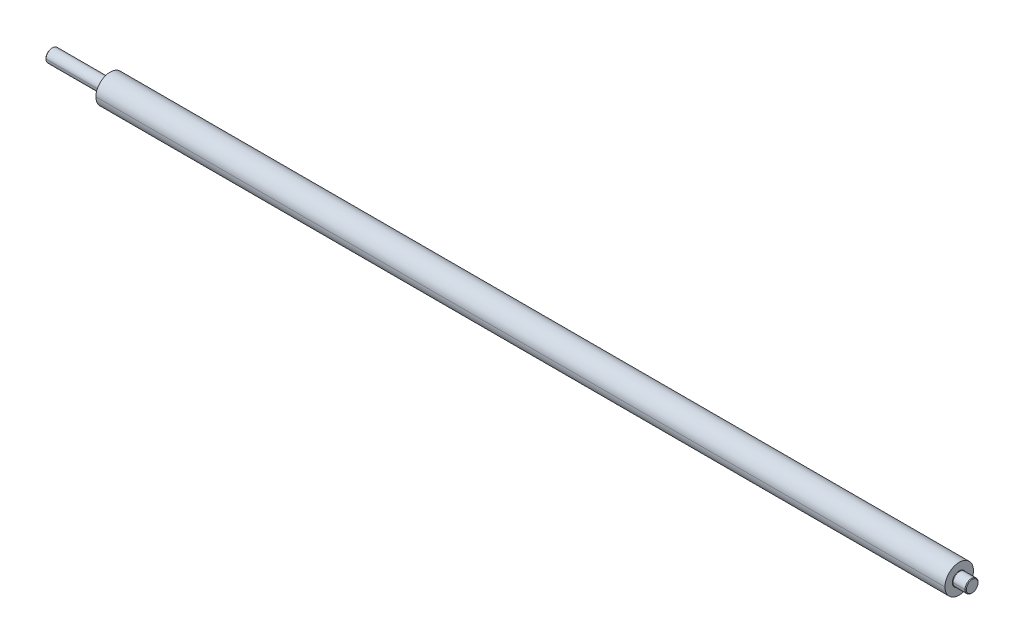
ISO-10303-21;
HEADER;
FILE_DESCRIPTION(('STEP AP214'),'2;1');
FILE_NAME('part.step','',(''),(''),'','','');
FILE_SCHEMA(('AUTOMOTIVE_DESIGN { 1 0 10303 214 1 1 1 1 }'));
ENDSEC;
DATA;
#1=APPLICATION_CONTEXT('core data for automotive mechanical design processes');
#2=APPLICATION_PROTOCOL_DEFINITION('international standard','automotive_design',2000,#1);
#3=PRODUCT_CONTEXT('',#1,'mechanical');
#4=PRODUCT('Part','Part','',(#3));
#5=PRODUCT_RELATED_PRODUCT_CATEGORY('part','',(#4));
#6=PRODUCT_DEFINITION_FORMATION('','',#4);
#7=PRODUCT_DEFINITION_CONTEXT('part definition',#1,'design');
#8=PRODUCT_DEFINITION('design','',#6,#7);
#9=PRODUCT_DEFINITION_SHAPE('','',#8);
#10=(LENGTH_UNIT() NAMED_UNIT(*) SI_UNIT(.MILLI.,.METRE.));
#11=(NAMED_UNIT(*) PLANE_ANGLE_UNIT() SI_UNIT($,.RADIAN.));
#12=(NAMED_UNIT(*) SI_UNIT($,.STERADIAN.) SOLID_ANGLE_UNIT());
#13=UNCERTAINTY_MEASURE_WITH_UNIT(LENGTH_MEASURE(1.E-05),#10,'distance_accuracy_value','');
#14=(GEOMETRIC_REPRESENTATION_CONTEXT(3) GLOBAL_UNCERTAINTY_ASSIGNED_CONTEXT((#13)) GLOBAL_UNIT_ASSIGNED_CONTEXT((#10,
#11,#12)) REPRESENTATION_CONTEXT('',''));
#15=CARTESIAN_POINT('',(0.,0.,0.));
#16=DIRECTION('',(0.,0.,1.));
#17=DIRECTION('',(1.,0.,0.));
#18=AXIS2_PLACEMENT_3D('',#15,#16,#17);
#19=CARTESIAN_POINT('',(45.,0.,0.));
#20=DIRECTION('',(1.,0.,0.));
#21=DIRECTION('',(0.,0.,-1.));
#22=AXIS2_PLACEMENT_3D('',#19,#20,#21);
#23=PLANE('',#22);
#24=CARTESIAN_POINT('',(45.,0.,0.));
#25=DIRECTION('',(1.,0.,0.));
#26=DIRECTION('',(0.,0.,-1.));
#27=AXIS2_PLACEMENT_3D('',#24,#25,#26);
#28=CIRCLE('',#27,11.);
#29=CARTESIAN_POINT('',(45.,0.,11.));
#30=VERTEX_POINT('',#29);
#31=CARTESIAN_POINT('',(45.,0.,-11.));
#32=VERTEX_POINT('',#31);
#33=EDGE_CURVE('E11',#30,#32,#28,.T.);
#34=ORIENTED_EDGE('',*,*,#33,.F.);
#35=CARTESIAN_POINT('',(45.,0.,0.));
#36=DIRECTION('',(1.,0.,0.));
#37=DIRECTION('',(0.,0.,-1.));
#38=AXIS2_PLACEMENT_3D('',#35,#36,#37);
#39=CIRCLE('',#38,11.);
#40=EDGE_CURVE('E26',#32,#30,#39,.T.);
#41=ORIENTED_EDGE('',*,*,#40,.F.);
#42=EDGE_LOOP('',(#34,#41));
#43=FACE_BOUND('',#42,.T.);
#44=CARTESIAN_POINT('',(45.,0.,0.));
#45=DIRECTION('',(1.,0.,0.));
#46=DIRECTION('',(0.,0.,-1.));
#47=AXIS2_PLACEMENT_3D('',#44,#45,#46);
#48=CIRCLE('',#47,5.3);
#49=CARTESIAN_POINT('',(44.9999999999999,5.0405995363642,1.63779007018718));
#50=VERTEX_POINT('',#49);
#51=CARTESIAN_POINT('',(44.9999999999999,-5.0405995363642,-1.63779007018718));
#52=VERTEX_POINT('',#51);
#53=EDGE_CURVE('E251',#50,#52,#48,.T.);
#54=ORIENTED_EDGE('',*,*,#53,.T.);
#55=CARTESIAN_POINT('',(45.,-5.04059953636431,-1.63779007018722));
#56=CARTESIAN_POINT('',(45.,-4.52559033783726,-3.22063693866093));
#57=CARTESIAN_POINT('',(45.,-3.3917749273373,-4.6057664224149));
#58=CARTESIAN_POINT('',(45.,-1.7315428505631,-5.44954277934704));
#59=CARTESIAN_POINT('',(45.,1.83934733064044,-5.66092899865932));
#60=CARTESIAN_POINT('',(45.,4.6040084700311,-3.39099736879158));
#61=CARTESIAN_POINT('',(45.,5.4512051359101,-1.73250802647092));
#62=CARTESIAN_POINT('',(45.,5.55432238842267,0.0545252424096536));
#63=CARTESIAN_POINT('',(45.,5.04059953636431,1.63779007018722));
#64=B_SPLINE_CURVE_WITH_KNOTS('',5,(#55,#56,#57,#58,#59,#60,#61,#62,#63),.UNSPECIFIED.,.F.,.F.,
(6,3,6),(0.,1.5707963267949,3.14159265358979),.UNSPECIFIED.);
#65=EDGE_CURVE('E254',#52,#50,#64,.T.);
#66=ORIENTED_EDGE('',*,*,#65,.T.);
#67=EDGE_LOOP('',(#54,#66));
#68=FACE_BOUND('',#67,.T.);
#69=ADVANCED_FACE('F17',(#43,#68),#23,.F.);
#70=CARTESIAN_POINT('',(44.7,0.,0.));
#71=DIRECTION('',(1.,0.,0.));
#72=DIRECTION('',(0.,-0.309016994374947,0.951056516295154));
#73=AXIS2_PLACEMENT_3D('',#70,#71,#72);
#74=TOROIDAL_SURFACE('',#73,5.29999999999988,0.29999999999988);
#75=CARTESIAN_POINT('',(44.7,-5.0405995363642,-1.63779007018718));
#76=DIRECTION('',(0.,0.309016994374946,-0.951056516295154));
#77=DIRECTION('',(0.,0.951056516295154,0.309016994374946));
#78=AXIS2_PLACEMENT_3D('',#75,#76,#77);
#79=CIRCLE('',#78,0.29999999999988);
#80=CARTESIAN_POINT('',(44.7,-4.75528258147577,-1.54508497187474));
#81=VERTEX_POINT('',#80);
#82=EDGE_CURVE('E261',#81,#52,#79,.T.);
#83=ORIENTED_EDGE('',*,*,#82,.F.);
#84=CARTESIAN_POINT('',(44.7,0.,0.));
#85=DIRECTION('',(1.,0.,0.));
#86=DIRECTION('',(0.,0.,-1.));
#87=AXIS2_PLACEMENT_3D('',#84,#85,#86);
#88=CIRCLE('',#87,5.);
#89=CARTESIAN_POINT('',(44.7,0.,-5.));
#90=VERTEX_POINT('',#89);
#91=EDGE_CURVE('E265',#81,#90,#88,.T.);
#92=ORIENTED_EDGE('',*,*,#91,.T.);
#93=CARTESIAN_POINT('',(44.7,0.,0.));
#94=DIRECTION('',(1.,0.,0.));
#95=DIRECTION('',(0.,0.,-1.));
#96=AXIS2_PLACEMENT_3D('',#93,#94,#95);
#97=CIRCLE('',#96,5.);
#98=CARTESIAN_POINT('',(44.7,4.75528258147577,1.54508497187474));
#99=VERTEX_POINT('',#98);
#100=EDGE_CURVE('E275',#90,#99,#97,.T.);
#101=ORIENTED_EDGE('',*,*,#100,.T.);
#102=CARTESIAN_POINT('',(44.7,5.0405995363642,1.63779007018718));
#103=DIRECTION('',(0.,-0.309016994374946,0.951056516295154));
#104=DIRECTION('',(0.,-0.951056516295154,-0.309016994374946));
#105=AXIS2_PLACEMENT_3D('',#102,#103,#104);
#106=CIRCLE('',#105,0.29999999999988);
#107=EDGE_CURVE('E268',#99,#50,#106,.T.);
#108=ORIENTED_EDGE('',*,*,#107,.T.);
#109=ORIENTED_EDGE('',*,*,#65,.F.);
#110=EDGE_LOOP('',(#83,#92,#101,#108,#109));
#111=FACE_BOUND('',#110,.T.);
#112=ADVANCED_FACE('F243',(#111),#74,.F.);
#113=CARTESIAN_POINT('',(44.7,0.,0.));
#114=DIRECTION('',(1.,0.,0.));
#115=DIRECTION('',(0.,0.309016994374947,-0.951056516295154));
#116=AXIS2_PLACEMENT_3D('',#113,#114,#115);
#117=TOROIDAL_SURFACE('',#116,5.29999999999988,0.29999999999988);
#118=ORIENTED_EDGE('',*,*,#82,.T.);
#119=ORIENTED_EDGE('',*,*,#53,.F.);
#120=ORIENTED_EDGE('',*,*,#107,.F.);
#121=CARTESIAN_POINT('',(44.7,0.,0.));
#122=DIRECTION('',(1.,0.,0.));
#123=DIRECTION('',(0.,0.,-1.));
#124=AXIS2_PLACEMENT_3D('',#121,#122,#123);
#125=CIRCLE('',#124,5.);
#126=CARTESIAN_POINT('',(44.7,0.,5.));
#127=VERTEX_POINT('',#126);
#128=EDGE_CURVE('E276',#99,#127,#125,.T.);
#129=ORIENTED_EDGE('',*,*,#128,.T.);
#130=CARTESIAN_POINT('',(44.7,0.,0.));
#131=DIRECTION('',(1.,0.,0.));
#132=DIRECTION('',(0.,0.,-1.));
#133=AXIS2_PLACEMENT_3D('',#130,#131,#132);
#134=CIRCLE('',#133,5.);
#135=EDGE_CURVE('E263',#127,#81,#134,.T.);
#136=ORIENTED_EDGE('',*,*,#135,.T.);
#137=EDGE_LOOP('',(#118,#119,#120,#129,#136));
#138=FACE_BOUND('',#137,.T.);
#139=ADVANCED_FACE('F247',(#138),#117,.F.);
#140=CARTESIAN_POINT('',(45.,0.,0.));
#141=DIRECTION('',(1.,0.,0.));
#142=DIRECTION('',(0.,1.,0.));
#143=AXIS2_PLACEMENT_3D('',#140,#141,#142);
#144=CYLINDRICAL_SURFACE('',#143,5.);
#145=DIRECTION('',(1.,0.,0.));
#146=VECTOR('',#145,1.);
#147=CARTESIAN_POINT('',(0.5,0.,5.));
#148=LINE('',#147,#146);
#149=CARTESIAN_POINT('',(0.500000000000001,0.,5.));
#150=VERTEX_POINT('',#149);
#151=EDGE_CURVE('E348',#150,#127,#148,.T.);
#152=ORIENTED_EDGE('',*,*,#151,.F.);
#153=CARTESIAN_POINT('',(0.5,0.,0.));
#154=DIRECTION('',(1.,0.,0.));
#155=DIRECTION('',(0.,0.,-1.));
#156=AXIS2_PLACEMENT_3D('',#153,#154,#155);
#157=CIRCLE('',#156,5.);
#158=CARTESIAN_POINT('',(0.5,0.,-5.));
#159=VERTEX_POINT('',#158);
#160=EDGE_CURVE('E344',#150,#159,#157,.T.);
#161=ORIENTED_EDGE('',*,*,#160,.T.);
#162=DIRECTION('',(1.,0.,0.));
#163=VECTOR('',#162,1.);
#164=CARTESIAN_POINT('',(0.5,0.,-5.));
#165=LINE('',#164,#163);
#166=EDGE_CURVE('E339',#159,#90,#165,.T.);
#167=ORIENTED_EDGE('',*,*,#166,.T.);
#168=ORIENTED_EDGE('',*,*,#91,.F.);
#169=ORIENTED_EDGE('',*,*,#135,.F.);
#170=EDGE_LOOP('',(#152,#161,#167,#168,#169));
#171=FACE_BOUND('',#170,.T.);
#172=ADVANCED_FACE('F366',(#171),#144,.T.);
#173=CARTESIAN_POINT('',(45.,0.,0.));
#174=DIRECTION('',(1.,0.,0.));
#175=DIRECTION('',(0.,-1.,0.));
#176=AXIS2_PLACEMENT_3D('',#173,#174,#175);
#177=CYLINDRICAL_SURFACE('',#176,5.);
#178=ORIENTED_EDGE('',*,*,#151,.T.);
#179=ORIENTED_EDGE('',*,*,#128,.F.);
#180=ORIENTED_EDGE('',*,*,#100,.F.);
#181=ORIENTED_EDGE('',*,*,#166,.F.);
#182=CARTESIAN_POINT('',(0.5,0.,0.));
#183=DIRECTION('',(1.,0.,0.));
#184=DIRECTION('',(0.,0.,-1.));
#185=AXIS2_PLACEMENT_3D('',#182,#183,#184);
#186=CIRCLE('',#185,5.);
#187=EDGE_CURVE('E334',#159,#150,#186,.T.);
#188=ORIENTED_EDGE('',*,*,#187,.T.);
#189=EDGE_LOOP('',(#178,#179,#180,#181,#188));
#190=FACE_BOUND('',#189,.T.);
#191=ADVANCED_FACE('F362',(#190),#177,.T.);
#192=CARTESIAN_POINT('',(0.,0.,0.));
#193=DIRECTION('',(1.,0.,0.));
#194=DIRECTION('',(0.,-1.,0.));
#195=AXIS2_PLACEMENT_3D('',#192,#193,#194);
#196=CONICAL_SURFACE('',#195,4.5,0.785398163397448);
#197=DIRECTION('',(0.707106781186548,0.,0.707106781186547));
#198=VECTOR('',#197,1.);
#199=CARTESIAN_POINT('',(0.,0.,4.5));
#200=LINE('',#199,#198);
#201=CARTESIAN_POINT('',(0.,0.,4.5));
#202=VERTEX_POINT('',#201);
#203=EDGE_CURVE('E329',#202,#150,#200,.T.);
#204=ORIENTED_EDGE('',*,*,#203,.T.);
#205=ORIENTED_EDGE('',*,*,#187,.F.);
#206=DIRECTION('',(0.707106781186548,0.,-0.707106781186547));
#207=VECTOR('',#206,1.);
#208=CARTESIAN_POINT('',(0.,0.,-4.5));
#209=LINE('',#208,#207);
#210=CARTESIAN_POINT('',(0.,0.,-4.5));
#211=VERTEX_POINT('',#210);
#212=EDGE_CURVE('E324',#211,#159,#209,.T.);
#213=ORIENTED_EDGE('',*,*,#212,.F.);
#214=CARTESIAN_POINT('',(0.,0.,0.));
#215=DIRECTION('',(1.,0.,0.));
#216=DIRECTION('',(0.,0.,-1.));
#217=AXIS2_PLACEMENT_3D('',#214,#215,#216);
#218=CIRCLE('',#217,4.5);
#219=EDGE_CURVE('E313',#211,#202,#218,.T.);
#220=ORIENTED_EDGE('',*,*,#219,.T.);
#221=EDGE_LOOP('',(#204,#205,#213,#220));
#222=FACE_BOUND('',#221,.T.);
#223=ADVANCED_FACE('F374',(#222),#196,.T.);
#224=CARTESIAN_POINT('',(0.,0.,0.));
#225=DIRECTION('',(1.,0.,0.));
#226=DIRECTION('',(0.,0.,-1.));
#227=AXIS2_PLACEMENT_3D('',#224,#225,#226);
#228=PLANE('',#227);
#229=CARTESIAN_POINT('',(0.,0.,0.));
#230=DIRECTION('',(1.,0.,0.));
#231=DIRECTION('',(0.,0.,-1.));
#232=AXIS2_PLACEMENT_3D('',#229,#230,#231);
#233=CIRCLE('',#232,4.5);
#234=EDGE_CURVE('E310',#202,#211,#233,.T.);
#235=ORIENTED_EDGE('',*,*,#234,.F.);
#236=ORIENTED_EDGE('',*,*,#219,.F.);
#237=EDGE_LOOP('',(#235,#236));
#238=FACE_BOUND('',#237,.T.);
#239=ADVANCED_FACE('F376',(#238),#228,.F.);
#240=CARTESIAN_POINT('',(0.,0.,0.));
#241=DIRECTION('',(1.,0.,0.));
#242=DIRECTION('',(0.,1.,0.));
#243=AXIS2_PLACEMENT_3D('',#240,#241,#242);
#244=CONICAL_SURFACE('',#243,4.5,0.785398163397448);
#245=ORIENTED_EDGE('',*,*,#203,.F.);
#246=ORIENTED_EDGE('',*,*,#234,.T.);
#247=ORIENTED_EDGE('',*,*,#212,.T.);
#248=ORIENTED_EDGE('',*,*,#160,.F.);
#249=EDGE_LOOP('',(#245,#246,#247,#248));
#250=FACE_BOUND('',#249,.T.);
#251=ADVANCED_FACE('F370',(#250),#244,.T.);
#252=CARTESIAN_POINT('',(700.,0.,0.));
#253=DIRECTION('',(1.,0.,0.));
#254=DIRECTION('',(0.,-1.,0.));
#255=AXIS2_PLACEMENT_3D('',#252,#253,#254);
#256=CYLINDRICAL_SURFACE('',#255,11.);
#257=DIRECTION('',(1.,0.,0.));
#258=VECTOR('',#257,1.);
#259=CARTESIAN_POINT('',(45.,0.,11.));
#260=LINE('',#259,#258);
#261=CARTESIAN_POINT('',(700.,0.,11.));
#262=VERTEX_POINT('',#261);
#263=EDGE_CURVE('E301',#30,#262,#260,.T.);
#264=ORIENTED_EDGE('',*,*,#263,.T.);
#265=CARTESIAN_POINT('',(700.,0.,0.));
#266=DIRECTION('',(1.,0.,0.));
#267=DIRECTION('',(0.,0.,-1.));
#268=AXIS2_PLACEMENT_3D('',#265,#266,#267);
#269=CIRCLE('',#268,11.);
#270=CARTESIAN_POINT('',(700.,0.,-11.));
#271=VERTEX_POINT('',#270);
#272=EDGE_CURVE('E306',#271,#262,#269,.T.);
#273=ORIENTED_EDGE('',*,*,#272,.F.);
#274=DIRECTION('',(1.,0.,0.));
#275=VECTOR('',#274,1.);
#276=CARTESIAN_POINT('',(45.,0.,-11.));
#277=LINE('',#276,#275);
#278=EDGE_CURVE('E304',#32,#271,#277,.T.);
#279=ORIENTED_EDGE('',*,*,#278,.F.);
#280=ORIENTED_EDGE('',*,*,#40,.T.);
#281=EDGE_LOOP('',(#264,#273,#279,#280));
#282=FACE_BOUND('',#281,.T.);
#283=ADVANCED_FACE('F300',(#282),#256,.T.);
#284=CARTESIAN_POINT('',(700.,0.,0.));
#285=DIRECTION('',(1.,0.,0.));
#286=DIRECTION('',(0.,1.,0.));
#287=AXIS2_PLACEMENT_3D('',#284,#285,#286);
#288=CYLINDRICAL_SURFACE('',#287,11.);
#289=ORIENTED_EDGE('',*,*,#263,.F.);
#290=ORIENTED_EDGE('',*,*,#33,.T.);
#291=ORIENTED_EDGE('',*,*,#278,.T.);
#292=CARTESIAN_POINT('',(700.,0.,0.));
#293=DIRECTION('',(1.,0.,0.));
#294=DIRECTION('',(0.,0.,-1.));
#295=AXIS2_PLACEMENT_3D('',#292,#293,#294);
#296=CIRCLE('',#295,11.);
#297=EDGE_CURVE('E222',#262,#271,#296,.T.);
#298=ORIENTED_EDGE('',*,*,#297,.F.);
#299=EDGE_LOOP('',(#289,#290,#291,#298));
#300=FACE_BOUND('',#299,.T.);
#301=ADVANCED_FACE('F191',(#300),#288,.T.);
#302=CARTESIAN_POINT('',(700.,11.,0.));
#303=DIRECTION('',(-1.,0.,0.));
#304=DIRECTION('',(0.,0.,1.));
#305=AXIS2_PLACEMENT_3D('',#302,#303,#304);
#306=PLANE('',#305);
#307=CARTESIAN_POINT('',(700.000000000007,5.04059953635769,1.63779007018507));
#308=CARTESIAN_POINT('',(700.000000000007,5.0138029814739,1.72026733897912));
#309=CARTESIAN_POINT('',(700.000000000007,4.98497875743656,1.80208561354297));
#310=CARTESIAN_POINT('',(700.000000000007,4.92335196993031,1.96420994002449));
#311=CARTESIAN_POINT('',(700.000000000007,4.89054940646139,2.04451599194216));
#312=CARTESIAN_POINT('',(700.000000000007,4.82104293896748,2.20342163894555));
#313=CARTESIAN_POINT('',(700.000000000007,4.7843390349425,2.28202123403127));
#314=CARTESIAN_POINT('',(700.000000000007,4.70711885195321,2.43732482034848));
#315=CARTESIAN_POINT('',(700.000000000007,4.66660257298891,2.51402881157996));
#316=CARTESIAN_POINT('',(700.000000000007,4.58185510197058,2.66535634828095));
#317=CARTESIAN_POINT('',(700.000000000007,4.53762390991655,2.73997989375046));
#318=CARTESIAN_POINT('',(700.000000000007,4.44555320849852,2.88696677908094));
#319=CARTESIAN_POINT('',(700.000000000007,4.39771369913452,2.95933011894191));
#320=CARTESIAN_POINT('',(700.000000000007,4.29854160222449,3.1016222594628));
#321=CARTESIAN_POINT('',(700.000000000007,4.24720901467847,3.17155106012271));
#322=CARTESIAN_POINT('',(700.000000000007,4.1411744289015,3.30880565869901));
#323=CARTESIAN_POINT('',(700.000000000007,4.08647243067054,3.3761314566154));
#324=CARTESIAN_POINT('',(700.000000000007,3.97383080467919,3.50801785567549));
#325=CARTESIAN_POINT('',(700.000000000007,3.91589117691879,3.5725784568192));
#326=CARTESIAN_POINT('',(700.000000000007,3.79691387370757,3.69877893026728));
#327=CARTESIAN_POINT('',(700.000000000007,3.73587619825676,3.76041880257166));
#328=CARTESIAN_POINT('',(700.000000000007,3.61084984471733,3.88062932246923));
#329=CARTESIAN_POINT('',(700.000000000007,3.54686116662871,3.93919997006242));
#330=CARTESIAN_POINT('',(700.000000000007,3.41608696215837,4.05313093872288));
#331=CARTESIAN_POINT('',(700.000000000007,3.34930143577664,4.10849125979014));
#332=CARTESIAN_POINT('',(700.000000000007,3.21309442689897,4.21586820753481));
#333=CARTESIAN_POINT('',(700.000000000007,3.14367294440304,4.26788483421222));
#334=CARTESIAN_POINT('',(700.000000000007,3.00236126572993,4.36844908056781));
#335=CARTESIAN_POINT('',(700.000000000007,2.93047106955276,4.41699670024598));
#336=CARTESIAN_POINT('',(700.000000000007,2.78439515329633,4.51050597713491));
#337=CARTESIAN_POINT('',(700.000000000007,2.71020943321708,4.55546763434567));
#338=CARTESIAN_POINT('',(700.000000000007,2.55972118905413,4.6416966697294));
#339=CARTESIAN_POINT('',(700.000000000007,2.48341866497044,4.68296404790237));
#340=CARTESIAN_POINT('',(700.000000000007,2.32888063226243,4.7617051084819));
#341=CARTESIAN_POINT('',(700.000000000007,2.25064512363812,4.79917879088847));
#342=CARTESIAN_POINT('',(700.000000000007,2.09242959804175,4.87024218255197));
#343=CARTESIAN_POINT('',(700.000000000007,2.01244958106971,4.9038318918089));
#344=CARTESIAN_POINT('',(700.000000000007,1.8509377176442,4.96704641662143));
#345=CARTESIAN_POINT('',(700.000000000007,1.76940587119074,4.99667123217702));
#346=CARTESIAN_POINT('',(700.000000000007,1.60498676616185,5.05188460081137));
#347=CARTESIAN_POINT('',(700.000000000007,1.52209950758643,5.07747315389012));
#348=CARTESIAN_POINT('',(700.000000000007,1.35516926097959,5.12455235250512));
#349=CARTESIAN_POINT('',(700.000000000007,1.27112627294817,5.14604299804137));
#350=CARTESIAN_POINT('',(700.000000000007,1.10208703434881,5.18487460872391));
#351=CARTESIAN_POINT('',(700.000000000007,1.01709078378086,5.20221557387021));
#352=CARTESIAN_POINT('',(700.000000000007,0.846349783520858,5.23270604786892));
#353=CARTESIAN_POINT('',(700.000000000007,0.760605033828797,5.24585555672133));
#354=CARTESIAN_POINT('',(700.000000000007,0.588573601932922,5.26793143981368));
#355=CARTESIAN_POINT('',(700.000000000007,0.502286919729107,5.27685781405362));
#356=CARTESIAN_POINT('',(700.000000000007,0.329379494984971,5.29046592350364));
#357=CARTESIAN_POINT('',(700.000000000007,0.24275875244465,5.29514765871371));
#358=CARTESIAN_POINT('',(700.000000000007,0.0693918839833639,5.30025521139378));
#359=CARTESIAN_POINT('',(700.000000000007,-0.0173542419376004,5.30068102886379));
#360=CARTESIAN_POINT('',(700.000000000007,-0.190762898144768,5.29727572023216));
#361=CARTESIAN_POINT('',(700.000000000007,-0.277425428430972,5.29344459413052));
#362=CARTESIAN_POINT('',(700.000000000007,-0.450458115742415,5.28153462787394));
#363=CARTESIAN_POINT('',(700.000000000007,-0.536828272767655,5.273455787719));
#364=CARTESIAN_POINT('',(700.000000000007,-0.709068140283767,5.25306985598938));
#365=CARTESIAN_POINT('',(700.000000000007,-0.794937850774639,5.24076276441469));
#366=CARTESIAN_POINT('',(700.000000000007,-0.965969957568143,5.21194997870716));
#367=CARTESIAN_POINT('',(700.000000000007,-1.05113235387077,5.1954442845743));
#368=CARTESIAN_POINT('',(700.000000000007,-1.22054466861576,5.15827405741333));
#369=CARTESIAN_POINT('',(700.000000000007,-1.30479458705811,5.13760952438521));
#370=CARTESIAN_POINT('',(700.000000000007,-1.47217898064959,5.09217140210375));
#371=CARTESIAN_POINT('',(700.000000000007,-1.55531345579872,5.06739781285041));
#372=CARTESIAN_POINT('',(700.000000000007,-1.72026668457139,5.01380125986496));
#373=CARTESIAN_POINT('',(700.000000000007,-1.80208543819494,4.98497829613284));
#374=CARTESIAN_POINT('',(700.000000000007,-1.9642101153725,4.92335243123404));
#375=CARTESIAN_POINT('',(700.000000000007,-2.04451603892651,4.89054953006735));
#376=CARTESIAN_POINT('',(700.000000000007,-2.20342159196118,4.82104281536153));
#377=CARTESIAN_POINT('',(700.000000000007,-2.28202122144184,4.78433900182238));
#378=CARTESIAN_POINT('',(700.000000000007,-2.43732483293789,4.70711888507333));
#379=CARTESIAN_POINT('',(700.000000000007,-2.51402881495328,4.66660258186342));
#380=CARTESIAN_POINT('',(700.000000000007,-2.66535634490761,4.58185509309608));
#381=CARTESIAN_POINT('',(700.000000000007,-2.73997989284657,4.53762390753864));
#382=CARTESIAN_POINT('',(700.000000000007,-2.88696677998481,4.44555321087644));
#383=CARTESIAN_POINT('',(700.000000000007,-2.9593301191841,4.39771369977168));
#384=CARTESIAN_POINT('',(700.000000000007,-3.1016222592206,4.29854160158734));
#385=CARTESIAN_POINT('',(700.000000000007,-3.17155106005781,4.24720901450775));
#386=CARTESIAN_POINT('',(700.000000000007,-3.3088056587639,4.14117442907223));
#387=CARTESIAN_POINT('',(700.000000000007,-3.37613145663278,4.0864724307163));
#388=CARTESIAN_POINT('',(700.000000000007,-3.50801785565809,3.97383080463345));
#389=CARTESIAN_POINT('',(700.000000000007,-3.57257845681453,3.91589117690653));
#390=CARTESIAN_POINT('',(700.000000000007,-3.69877893027193,3.79691387371983));
#391=CARTESIAN_POINT('',(700.000000000007,-3.7604188025729,3.73587619826005));
#392=CARTESIAN_POINT('',(700.000000000007,-3.88062932246797,3.61084984471405));
#393=CARTESIAN_POINT('',(700.000000000007,-3.93919997006208,3.54686116662784));
#394=CARTESIAN_POINT('',(700.000000000007,-4.05313093872321,3.41608696215926));
#395=CARTESIAN_POINT('',(700.000000000007,-4.10849125979022,3.34930143577688));
#396=CARTESIAN_POINT('',(700.000000000007,-4.21586820753471,3.21309442689875));
#397=CARTESIAN_POINT('',(700.000000000007,-4.26788483421219,3.14367294440298));
#398=CARTESIAN_POINT('',(700.000000000007,-4.36844908056782,3.00236126573));
#399=CARTESIAN_POINT('',(700.000000000007,-4.41699670024598,2.93047106955279));
#400=CARTESIAN_POINT('',(700.000000000007,-4.5105059771349,2.78439515329633));
#401=CARTESIAN_POINT('',(700.000000000007,-4.55546763434566,2.71020943321708));
#402=CARTESIAN_POINT('',(700.000000000007,-4.64169666972939,2.55972118905415));
#403=CARTESIAN_POINT('',(700.000000000007,-4.68296404790237,2.48341866497045));
#404=CARTESIAN_POINT('',(700.000000000007,-4.7617051084819,2.32888063226244));
#405=CARTESIAN_POINT('',(700.000000000007,-4.79917879088846,2.25064512363812));
#406=CARTESIAN_POINT('',(700.000000000007,-4.87024218255197,2.09242959804176));
#407=CARTESIAN_POINT('',(700.000000000007,-4.90383189180892,2.01244958106971));
#408=CARTESIAN_POINT('',(700.000000000007,-4.96704641662141,1.85093771764422));
#409=CARTESIAN_POINT('',(700.000000000007,-4.99667123217696,1.76940587119077));
#410=CARTESIAN_POINT('',(700.000000000007,-5.05188460081143,1.60498676616185));
#411=CARTESIAN_POINT('',(700.000000000007,-5.07747315389036,1.52209950758637));
#412=CARTESIAN_POINT('',(700.000000000007,-5.12455235250487,1.35516926097966));
#413=CARTESIAN_POINT('',(700.000000000007,-5.14604299804046,1.27112627294843));
#414=CARTESIAN_POINT('',(700.000000000007,-5.18487460872482,1.10208703434857));
#415=CARTESIAN_POINT('',(700.000000000007,-5.2022155738736,1.01709078377995));
#416=CARTESIAN_POINT('',(700.000000000007,-5.23270604786552,0.846349783521789));
#417=CARTESIAN_POINT('',(700.000000000007,-5.24585555670867,0.760605033832245));
#418=CARTESIAN_POINT('',(700.000000000007,-5.26793143982633,0.588573601929499));
#419=CARTESIAN_POINT('',(700.000000000007,-5.27685781410085,0.502286919716297));
#420=CARTESIAN_POINT('',(700.000000000007,-5.2904659234564,0.329379494997802));
#421=CARTESIAN_POINT('',(700.000000000007,-5.29514765853744,0.24275875249251));
#422=CARTESIAN_POINT('',(700.000000000007,-5.30025521157005,0.0693918839355261));
#423=CARTESIAN_POINT('',(700.000000000007,-5.30068102952162,-0.0173542421161648));
#424=CARTESIAN_POINT('',(700.000000000007,-5.29727571957433,-0.190762897966183));
#425=CARTESIAN_POINT('',(700.000000000007,-5.29344459167546,-0.27742542776451));
#426=CARTESIAN_POINT('',(700.000000000007,-5.281534630329,-0.450458116408854));
#427=CARTESIAN_POINT('',(700.000000000007,-5.27345579688142,-0.536828275254871));
#428=CARTESIAN_POINT('',(700.000000000007,-5.25306984682696,-0.709068137796527));
#429=CARTESIAN_POINT('',(700.000000000007,-5.24076273022008,-0.794937841492165));
#430=CARTESIAN_POINT('',(700.000000000007,-5.21195001290177,-0.965969966850589));
#431=CARTESIAN_POINT('',(700.000000000007,-5.19544441219035,-1.05113238851337));
#432=CARTESIAN_POINT('',(700.000000000007,-5.1582739297973,-1.22054463397313));
#433=CARTESIAN_POINT('',(700.000000000007,-5.13760904811568,-1.3047944577701));
#434=CARTESIAN_POINT('',(700.000000000007,-5.09217187837328,-1.47217910993758));
#435=CARTESIAN_POINT('',(700.000000000007,-5.06739959031251,-1.55531393830809));
#436=CARTESIAN_POINT('',(700.000000000007,-5.04059953635769,-1.63779007018505));
#437=B_SPLINE_CURVE_WITH_KNOTS('',3,(#307,#308,#309,#310,#311,#312,#313,#314,#315,#316,#317,
#318,#319,#320,#321,#322,#323,#324,#325,#326,#327,#328,#329,#330,#331,#332,#333,#334,#335,#336,
#337,#338,#339,#340,#341,#342,#343,#344,#345,#346,#347,#348,#349,#350,#351,#352,#353,#354,#355,
#356,#357,#358,#359,#360,#361,#362,#363,#364,#365,#366,#367,#368,#369,#370,#371,#372,#373,#374,
#375,#376,#377,#378,#379,#380,#381,#382,#383,#384,#385,#386,#387,#388,#389,#390,#391,#392,#393,
#394,#395,#396,#397,#398,#399,#400,#401,#402,#403,#404,#405,#406,#407,#408,#409,#410,#411,#412,
#413,#414,#415,#416,#417,#418,#419,#420,#421,#422,#423,#424,#425,#426,#427,#428,#429,#430,#431,
#432,#433,#434,#435,#436),.UNSPECIFIED.,.F.,.F.,(4,2,2,2,2,2,2,2,2,2,2,2,2,2,2,2,2,2,2,2,2,2,2,
2,2,2,2,2,2,2,2,2,2,2,2,2,2,2,2,2,2,2,2,2,2,2,2,2,2,2,2,2,2,2,2,2,2,2,2,2,2,2,2,2,4),(0.,
0.260137022342528,0.520274044685055,0.780411067027584,1.04054808937011,1.30068511171264,
1.56082213405517,1.82095915639769,2.08109617874022,2.34123320108275,2.60137022342528,
2.86150724576781,3.12164426811034,3.38178129045286,3.64191831279539,3.90205533513792,
4.16219235748045,4.42232937982297,4.6824664021655,4.94260342450803,5.20274044685056,
5.46287746919309,5.72301449153561,5.98315151387814,6.24328853622067,6.5034255585632,
6.76356258090572,7.02369960324825,7.28383662559078,7.54397364793331,7.80411067027583,
8.06424769261836,8.32438471496089,8.58452173730342,8.84465875964594,9.10479578198847,
9.364932804331,9.62506982667353,9.88520684901606,10.1453438713586,10.4054808937011,
10.6656179160436,10.9257549383862,11.1858919607287,11.4460289830712,11.7061660054138,
11.9663030277563,12.2264400500988,12.4865770724413,12.7467140947839,13.0068511171264,
13.2669881394689,13.5271251618114,13.787262184154,14.0473992064965,14.307536228839,
14.5676732511816,14.8278102735241,15.0879472958666,15.3480843182091,15.6082213405517,
15.8683583628942,16.1284953852367,16.3886324075792,16.6487694299218),.UNSPECIFIED.);
#438=CARTESIAN_POINT('',(700.000000000007,5.04059953635769,1.63779007018507));
#439=VERTEX_POINT('',#438);
#440=CARTESIAN_POINT('',(700.000000000007,-5.04059953635768,-1.63779007018507));
#441=VERTEX_POINT('',#440);
#442=EDGE_CURVE('E214',#439,#441,#437,.T.);
#443=ORIENTED_EDGE('',*,*,#442,.F.);
#444=CARTESIAN_POINT('',(700.000000000007,-5.04059953635768,-1.63779007018507));
#445=CARTESIAN_POINT('',(700.000000000007,-5.0138029814739,-1.72026733897912));
#446=CARTESIAN_POINT('',(700.000000000007,-4.98497875743656,-1.80208561354297));
#447=CARTESIAN_POINT('',(700.000000000007,-4.92335196993031,-1.96420994002449));
#448=CARTESIAN_POINT('',(700.000000000007,-4.89054940646139,-2.04451599194215));
#449=CARTESIAN_POINT('',(700.000000000007,-4.82104293896748,-2.20342163894555));
#450=CARTESIAN_POINT('',(700.000000000007,-4.7843390349425,-2.28202123403127));
#451=CARTESIAN_POINT('',(700.000000000007,-4.70711885195321,-2.43732482034848));
#452=CARTESIAN_POINT('',(700.000000000007,-4.66660257298891,-2.51402881157996));
#453=CARTESIAN_POINT('',(700.000000000007,-4.58185510197058,-2.66535634828095));
#454=CARTESIAN_POINT('',(700.000000000007,-4.53762390991655,-2.73997989375046));
#455=CARTESIAN_POINT('',(700.000000000007,-4.44555320849852,-2.88696677908094));
#456=CARTESIAN_POINT('',(700.000000000007,-4.39771369913452,-2.95933011894191));
#457=CARTESIAN_POINT('',(700.000000000007,-4.29854160222449,-3.1016222594628));
#458=CARTESIAN_POINT('',(700.000000000007,-4.24720901467847,-3.17155106012271));
#459=CARTESIAN_POINT('',(700.000000000007,-4.1411744289015,-3.30880565869901));
#460=CARTESIAN_POINT('',(700.000000000007,-4.08647243067054,-3.3761314566154));
#461=CARTESIAN_POINT('',(700.000000000007,-3.97383080467919,-3.50801785567549));
#462=CARTESIAN_POINT('',(700.000000000007,-3.91589117691879,-3.57257845681919));
#463=CARTESIAN_POINT('',(700.000000000007,-3.79691387370757,-3.69877893026728));
#464=CARTESIAN_POINT('',(700.000000000007,-3.73587619825676,-3.76041880257165));
#465=CARTESIAN_POINT('',(700.000000000007,-3.61084984471733,-3.88062932246923));
#466=CARTESIAN_POINT('',(700.000000000007,-3.54686116662872,-3.93919997006242));
#467=CARTESIAN_POINT('',(700.000000000007,-3.41608696215837,-4.05313093872288));
#468=CARTESIAN_POINT('',(700.000000000007,-3.34930143577664,-4.10849125979013));
#469=CARTESIAN_POINT('',(700.000000000007,-3.21309442689898,-4.2158682075348));
#470=CARTESIAN_POINT('',(700.000000000007,-3.14367294440304,-4.26788483421222));
#471=CARTESIAN_POINT('',(700.000000000007,-3.00236126572993,-4.3684490805678));
#472=CARTESIAN_POINT('',(700.000000000007,-2.93047106955276,-4.41699670024598));
#473=CARTESIAN_POINT('',(700.000000000007,-2.78439515329634,-4.51050597713491));
#474=CARTESIAN_POINT('',(700.000000000007,-2.71020943321708,-4.55546763434567));
#475=CARTESIAN_POINT('',(700.000000000007,-2.55972118905414,-4.64169666972939));
#476=CARTESIAN_POINT('',(700.000000000007,-2.48341866497045,-4.68296404790237));
#477=CARTESIAN_POINT('',(700.000000000007,-2.32888063226244,-4.7617051084819));
#478=CARTESIAN_POINT('',(700.000000000007,-2.25064512363812,-4.79917879088847));
#479=CARTESIAN_POINT('',(700.000000000007,-2.09242959804175,-4.87024218255197));
#480=CARTESIAN_POINT('',(700.000000000007,-2.01244958106971,-4.9038318918089));
#481=CARTESIAN_POINT('',(700.000000000007,-1.85093771764421,-4.96704641662143));
#482=CARTESIAN_POINT('',(700.000000000007,-1.76940587119075,-4.99667123217702));
#483=CARTESIAN_POINT('',(700.000000000007,-1.60498676616186,-5.05188460081137));
#484=CARTESIAN_POINT('',(700.000000000007,-1.52209950758643,-5.07747315389012));
#485=CARTESIAN_POINT('',(700.000000000007,-1.35516926097959,-5.12455235250512));
#486=CARTESIAN_POINT('',(700.000000000007,-1.27112627294817,-5.14604299804137));
#487=CARTESIAN_POINT('',(700.000000000007,-1.10208703434881,-5.18487460872391));
#488=CARTESIAN_POINT('',(700.000000000007,-1.01709078378087,-5.20221557387021));
#489=CARTESIAN_POINT('',(700.000000000007,-0.846349783520863,-5.23270604786891));
#490=CARTESIAN_POINT('',(700.000000000007,-0.760605033828802,-5.24585555672132));
#491=CARTESIAN_POINT('',(700.000000000007,-0.588573601932927,-5.26793143981368));
#492=CARTESIAN_POINT('',(700.000000000007,-0.502286919729112,-5.27685781405362));
#493=CARTESIAN_POINT('',(700.000000000007,-0.329379494984976,-5.29046592350363));
#494=CARTESIAN_POINT('',(700.000000000007,-0.242758752444655,-5.29514765871371));
#495=CARTESIAN_POINT('',(700.000000000007,-0.0693918839833683,-5.30025521139378));
#496=CARTESIAN_POINT('',(700.000000000007,0.0173542419375968,-5.30068102886379));
#497=CARTESIAN_POINT('',(700.000000000007,0.190762898144765,-5.29727572023216));
#498=CARTESIAN_POINT('',(700.000000000007,0.277425428430968,-5.29344459413052));
#499=CARTESIAN_POINT('',(700.000000000007,0.45045811574241,-5.28153462787394));
#500=CARTESIAN_POINT('',(700.000000000007,0.53682827276765,-5.273455787719));
#501=CARTESIAN_POINT('',(700.000000000007,0.709068140283761,-5.25306985598938));
#502=CARTESIAN_POINT('',(700.000000000007,0.794937850774631,-5.24076276441469));
#503=CARTESIAN_POINT('',(700.000000000007,0.965969957568134,-5.21194997870716));
#504=CARTESIAN_POINT('',(700.000000000007,1.05113235387077,-5.19544428457431));
#505=CARTESIAN_POINT('',(700.000000000007,1.22054466861575,-5.15827405741333));
#506=CARTESIAN_POINT('',(700.000000000007,1.30479458705811,-5.13760952438521));
#507=CARTESIAN_POINT('',(700.000000000007,1.47217898064959,-5.09217140210375));
#508=CARTESIAN_POINT('',(700.000000000007,1.55531345579872,-5.06739781285042));
#509=CARTESIAN_POINT('',(700.000000000007,1.72026668457139,-5.01380125986496));
#510=CARTESIAN_POINT('',(700.000000000007,1.80208543819494,-4.98497829613284));
#511=CARTESIAN_POINT('',(700.000000000007,1.96421011537249,-4.92335243123404));
#512=CARTESIAN_POINT('',(700.000000000007,2.0445160389265,-4.89054953006735));
#513=CARTESIAN_POINT('',(700.000000000007,2.20342159196118,-4.82104281536153));
#514=CARTESIAN_POINT('',(700.000000000007,2.28202122144184,-4.78433900182239));
#515=CARTESIAN_POINT('',(700.000000000007,2.43732483293789,-4.70711888507333));
#516=CARTESIAN_POINT('',(700.000000000007,2.51402881495327,-4.66660258186342));
#517=CARTESIAN_POINT('',(700.000000000007,2.66535634490761,-4.58185509309608));
#518=CARTESIAN_POINT('',(700.000000000007,2.73997989284656,-4.53762390753864));
#519=CARTESIAN_POINT('',(700.000000000007,2.88696677998481,-4.44555321087645));
#520=CARTESIAN_POINT('',(700.000000000007,2.95933011918409,-4.39771369977169));
#521=CARTESIAN_POINT('',(700.000000000007,3.10162225922059,-4.29854160158734));
#522=CARTESIAN_POINT('',(700.000000000007,3.17155106005781,-4.24720901450775));
#523=CARTESIAN_POINT('',(700.000000000007,3.3088056587639,-4.14117442907223));
#524=CARTESIAN_POINT('',(700.000000000007,3.37613145663278,-4.0864724307163));
#525=CARTESIAN_POINT('',(700.000000000007,3.50801785565809,-3.97383080463345));
#526=CARTESIAN_POINT('',(700.000000000007,3.57257845681452,-3.91589117690654));
#527=CARTESIAN_POINT('',(700.000000000007,3.69877893027193,-3.79691387371984));
#528=CARTESIAN_POINT('',(700.000000000007,3.76041880257289,-3.73587619826005));
#529=CARTESIAN_POINT('',(700.000000000007,3.88062932246797,-3.61084984471406));
#530=CARTESIAN_POINT('',(700.000000000007,3.93919997006208,-3.54686116662785));
#531=CARTESIAN_POINT('',(700.000000000007,4.0531309387232,-3.41608696215926));
#532=CARTESIAN_POINT('',(700.000000000007,4.10849125979021,-3.34930143577689));
#533=CARTESIAN_POINT('',(700.000000000007,4.21586820753471,-3.21309442689875));
#534=CARTESIAN_POINT('',(700.000000000007,4.26788483421218,-3.14367294440299));
#535=CARTESIAN_POINT('',(700.000000000007,4.36844908056782,-3.00236126573001));
#536=CARTESIAN_POINT('',(700.000000000007,4.41699670024598,-2.93047106955279));
#537=CARTESIAN_POINT('',(700.000000000007,4.51050597713489,-2.78439515329633));
#538=CARTESIAN_POINT('',(700.000000000007,4.55546763434566,-2.71020943321709));
#539=CARTESIAN_POINT('',(700.000000000007,4.64169666972939,-2.55972118905416));
#540=CARTESIAN_POINT('',(700.000000000007,4.68296404790236,-2.48341866497046));
#541=CARTESIAN_POINT('',(700.000000000007,4.76170510848189,-2.32888063226245));
#542=CARTESIAN_POINT('',(700.000000000007,4.79917879088846,-2.25064512363813));
#543=CARTESIAN_POINT('',(700.000000000007,4.87024218255196,-2.09242959804177));
#544=CARTESIAN_POINT('',(700.000000000007,4.90383189180891,-2.01244958106972));
#545=CARTESIAN_POINT('',(700.000000000007,4.9670464166214,-1.85093771764423));
#546=CARTESIAN_POINT('',(700.000000000007,4.99667123217695,-1.76940587119078));
#547=CARTESIAN_POINT('',(700.000000000007,5.05188460081143,-1.60498676616185));
#548=CARTESIAN_POINT('',(700.000000000007,5.07747315389036,-1.52209950758638));
#549=CARTESIAN_POINT('',(700.000000000007,5.12455235250487,-1.35516926097967));
#550=CARTESIAN_POINT('',(700.000000000007,5.14604299804046,-1.27112627294843));
#551=CARTESIAN_POINT('',(700.000000000007,5.18487460872482,-1.10208703434858));
#552=CARTESIAN_POINT('',(700.000000000007,5.2022155738736,-1.01709078377996));
#553=CARTESIAN_POINT('',(700.000000000007,5.23270604786552,-0.846349783521797));
#554=CARTESIAN_POINT('',(700.000000000007,5.24585555670867,-0.760605033832252));
#555=CARTESIAN_POINT('',(700.000000000007,5.26793143982633,-0.588573601929506));
#556=CARTESIAN_POINT('',(700.000000000007,5.27685781410085,-0.502286919716305));
#557=CARTESIAN_POINT('',(700.000000000007,5.2904659234564,-0.329379494997812));
#558=CARTESIAN_POINT('',(700.000000000007,5.29514765853744,-0.24275875249252));
#559=CARTESIAN_POINT('',(700.000000000007,5.30025521157005,-0.0693918839355363));
#560=CARTESIAN_POINT('',(700.000000000007,5.30068102952162,0.0173542421161546));
#561=CARTESIAN_POINT('',(700.000000000007,5.29727571957433,0.190762897966173));
#562=CARTESIAN_POINT('',(700.000000000007,5.29344459167546,0.2774254277645));
#563=CARTESIAN_POINT('',(700.000000000007,5.281534630329,0.450458116408844));
#564=CARTESIAN_POINT('',(700.000000000007,5.27345579688142,0.536828275254861));
#565=CARTESIAN_POINT('',(700.000000000007,5.25306984682696,0.709068137796518));
#566=CARTESIAN_POINT('',(700.000000000007,5.24076273022008,0.794937841492158));
#567=CARTESIAN_POINT('',(700.000000000007,5.21195001290177,0.965969966850584));
#568=CARTESIAN_POINT('',(700.000000000007,5.19544441219035,1.05113238851337));
#569=CARTESIAN_POINT('',(700.000000000007,5.1582739297973,1.22054463397312));
#570=CARTESIAN_POINT('',(700.000000000007,5.13760904811568,1.30479445777009));
#571=CARTESIAN_POINT('',(700.000000000007,5.09217187837328,1.47217910993757));
#572=CARTESIAN_POINT('',(700.000000000007,5.06739959031252,1.55531393830808));
#573=CARTESIAN_POINT('',(700.000000000007,5.04059953635769,1.63779007018504));
#574=B_SPLINE_CURVE_WITH_KNOTS('',3,(#444,#445,#446,#447,#448,#449,#450,#451,#452,#453,#454,
#455,#456,#457,#458,#459,#460,#461,#462,#463,#464,#465,#466,#467,#468,#469,#470,#471,#472,#473,
#474,#475,#476,#477,#478,#479,#480,#481,#482,#483,#484,#485,#486,#487,#488,#489,#490,#491,#492,
#493,#494,#495,#496,#497,#498,#499,#500,#501,#502,#503,#504,#505,#506,#507,#508,#509,#510,#511,
#512,#513,#514,#515,#516,#517,#518,#519,#520,#521,#522,#523,#524,#525,#526,#527,#528,#529,#530,
#531,#532,#533,#534,#535,#536,#537,#538,#539,#540,#541,#542,#543,#544,#545,#546,#547,#548,#549,
#550,#551,#552,#553,#554,#555,#556,#557,#558,#559,#560,#561,#562,#563,#564,#565,#566,#567,#568,
#569,#570,#571,#572,#573),.UNSPECIFIED.,.F.,.F.,(4,2,2,2,2,2,2,2,2,2,2,2,2,2,2,2,2,2,2,2,2,2,2,
2,2,2,2,2,2,2,2,2,2,2,2,2,2,2,2,2,2,2,2,2,2,2,2,2,2,2,2,2,2,2,2,2,2,2,2,2,2,2,2,2,4),(0.,
0.260137022342528,0.520274044685055,0.780411067027583,1.04054808937011,1.30068511171264,
1.56082213405517,1.82095915639769,2.08109617874022,2.34123320108275,2.60137022342528,
2.8615072457678,3.12164426811033,3.38178129045286,3.64191831279539,3.90205533513791,
4.16219235748044,4.42232937982297,4.6824664021655,4.94260342450803,5.20274044685055,
5.46287746919308,5.72301449153561,5.98315151387814,6.24328853622066,6.50342555856319,
6.76356258090572,7.02369960324825,7.28383662559077,7.5439736479333,7.80411067027583,
8.06424769261836,8.32438471496089,8.58452173730341,8.84465875964594,9.10479578198847,
9.364932804331,9.62506982667352,9.88520684901605,10.1453438713586,10.4054808937011,
10.6656179160436,10.9257549383862,11.1858919607287,11.4460289830712,11.7061660054137,
11.9663030277563,12.2264400500988,12.4865770724413,12.7467140947839,13.0068511171264,
13.2669881394689,13.5271251618114,13.787262184154,14.0473992064965,14.307536228839,
14.5676732511816,14.8278102735241,15.0879472958666,15.3480843182091,15.6082213405517,
15.8683583628942,16.1284953852367,16.3886324075792,16.6487694299218),.UNSPECIFIED.);
#575=EDGE_CURVE('E210',#441,#439,#574,.T.);
#576=ORIENTED_EDGE('',*,*,#575,.F.);
#577=EDGE_LOOP('',(#443,#576));
#578=FACE_BOUND('',#577,.T.);
#579=ORIENTED_EDGE('',*,*,#272,.T.);
#580=ORIENTED_EDGE('',*,*,#297,.T.);
#581=EDGE_LOOP('',(#579,#580));
#582=FACE_BOUND('',#581,.T.);
#583=ADVANCED_FACE('F185',(#578,#582),#306,.F.);
#584=CARTESIAN_POINT('',(700.3,0.,0.));
#585=DIRECTION('',(1.,0.,0.));
#586=DIRECTION('',(0.,-0.309016994374947,0.951056516295154));
#587=AXIS2_PLACEMENT_3D('',#584,#585,#586);
#588=TOROIDAL_SURFACE('',#587,5.29999999999303,0.299999999993084);
#589=CARTESIAN_POINT('',(700.3,-5.04059953635769,-1.63779007018507));
#590=DIRECTION('',(0.,0.309016994374947,-0.951056516295154));
#591=DIRECTION('',(-1.,0.,0.));
#592=AXIS2_PLACEMENT_3D('',#589,#590,#591);
#593=CIRCLE('',#592,0.299999999993133);
#594=CARTESIAN_POINT('',(700.3,-4.75528258147572,-1.54508497187472));
#595=VERTEX_POINT('',#594);
#596=EDGE_CURVE('E165',#441,#595,#593,.T.);
#597=ORIENTED_EDGE('',*,*,#596,.F.);
#598=ORIENTED_EDGE('',*,*,#575,.T.);
#599=CARTESIAN_POINT('',(700.3,5.04059953635769,1.63779007018507));
#600=DIRECTION('',(0.,-0.309016994374947,0.951056516295154));
#601=DIRECTION('',(-1.,0.,0.));
#602=AXIS2_PLACEMENT_3D('',#599,#600,#601);
#603=CIRCLE('',#602,0.299999999993133);
#604=CARTESIAN_POINT('',(700.3,4.75528258147572,1.54508497187472));
#605=VERTEX_POINT('',#604);
#606=EDGE_CURVE('E161',#439,#605,#603,.T.);
#607=ORIENTED_EDGE('',*,*,#606,.T.);
#608=CARTESIAN_POINT('',(700.3,0.,0.));
#609=DIRECTION('',(1.,0.,0.));
#610=DIRECTION('',(0.,0.,-1.));
#611=AXIS2_PLACEMENT_3D('',#608,#609,#610);
#612=CIRCLE('',#611,4.99999999999994);
#613=CARTESIAN_POINT('',(700.3,0.,-4.99999999999994));
#614=VERTEX_POINT('',#613);
#615=EDGE_CURVE('E156',#614,#605,#612,.T.);
#616=ORIENTED_EDGE('',*,*,#615,.F.);
#617=CARTESIAN_POINT('',(700.3,0.,0.));
#618=DIRECTION('',(1.,0.,0.));
#619=DIRECTION('',(0.,0.,-1.));
#620=AXIS2_PLACEMENT_3D('',#617,#618,#619);
#621=CIRCLE('',#620,4.99999999999994);
#622=EDGE_CURVE('E151',#595,#614,#621,.T.);
#623=ORIENTED_EDGE('',*,*,#622,.F.);
#624=EDGE_LOOP('',(#597,#598,#607,#616,#623));
#625=FACE_BOUND('',#624,.T.);
#626=ADVANCED_FACE('F174',(#625),#588,.F.);
#627=CARTESIAN_POINT('',(710.,0.,0.));
#628=DIRECTION('',(1.,0.,0.));
#629=DIRECTION('',(0.,1.,0.));
#630=AXIS2_PLACEMENT_3D('',#627,#628,#629);
#631=CYLINDRICAL_SURFACE('',#630,5.);
#632=DIRECTION('',(1.,0.,0.));
#633=VECTOR('',#632,1.);
#634=CARTESIAN_POINT('',(700.3,0.,5.));
#635=LINE('',#634,#633);
#636=CARTESIAN_POINT('',(700.3,0.,5.));
#637=VERTEX_POINT('',#636);
#638=CARTESIAN_POINT('',(709.5,0.,5.));
#639=VERTEX_POINT('',#638);
#640=EDGE_CURVE('E146',#637,#639,#635,.T.);
#641=ORIENTED_EDGE('',*,*,#640,.F.);
#642=CARTESIAN_POINT('',(700.3,0.,0.));
#643=DIRECTION('',(1.,0.,0.));
#644=DIRECTION('',(0.,0.,-1.));
#645=AXIS2_PLACEMENT_3D('',#642,#643,#644);
#646=CIRCLE('',#645,4.99999999999994);
#647=EDGE_CURVE('E141',#637,#595,#646,.T.);
#648=ORIENTED_EDGE('',*,*,#647,.T.);
#649=ORIENTED_EDGE('',*,*,#622,.T.);
#650=DIRECTION('',(1.,0.,0.));
#651=VECTOR('',#650,1.);
#652=CARTESIAN_POINT('',(700.3,0.,-5.));
#653=LINE('',#652,#651);
#654=CARTESIAN_POINT('',(709.5,0.,-5.));
#655=VERTEX_POINT('',#654);
#656=EDGE_CURVE('E137',#614,#655,#653,.T.);
#657=ORIENTED_EDGE('',*,*,#656,.T.);
#658=CARTESIAN_POINT('',(709.5,0.,0.));
#659=DIRECTION('',(1.,0.,0.));
#660=DIRECTION('',(0.,0.,-1.));
#661=AXIS2_PLACEMENT_3D('',#658,#659,#660);
#662=CIRCLE('',#661,5.);
#663=EDGE_CURVE('E133',#639,#655,#662,.T.);
#664=ORIENTED_EDGE('',*,*,#663,.F.);
#665=EDGE_LOOP('',(#641,#648,#649,#657,#664));
#666=FACE_BOUND('',#665,.T.);
#667=ADVANCED_FACE('F184',(#666),#631,.T.);
#668=CARTESIAN_POINT('',(709.5,0.,0.));
#669=DIRECTION('',(-1.,0.,0.));
#670=DIRECTION('',(0.,1.,0.));
#671=AXIS2_PLACEMENT_3D('',#668,#669,#670);
#672=CONICAL_SURFACE('',#671,5.,0.785398163397503);
#673=DIRECTION('',(-0.707106781186529,0.,-0.707106781186566));
#674=VECTOR('',#673,1.);
#675=CARTESIAN_POINT('',(710.,0.,-4.49999999999997));
#676=LINE('',#675,#674);
#677=CARTESIAN_POINT('',(710.,0.,-4.5));
#678=VERTEX_POINT('',#677);
#679=EDGE_CURVE('E110',#678,#655,#676,.T.);
#680=ORIENTED_EDGE('',*,*,#679,.F.);
#681=CARTESIAN_POINT('',(710.,0.,0.));
#682=DIRECTION('',(1.,0.,0.));
#683=DIRECTION('',(0.,0.,-1.));
#684=AXIS2_PLACEMENT_3D('',#681,#682,#683);
#685=CIRCLE('',#684,4.5);
#686=CARTESIAN_POINT('',(710.,0.,4.49999999999997));
#687=VERTEX_POINT('',#686);
#688=EDGE_CURVE('E103',#687,#678,#685,.T.);
#689=ORIENTED_EDGE('',*,*,#688,.F.);
#690=DIRECTION('',(-0.707106781186529,0.,0.707106781186566));
#691=VECTOR('',#690,1.);
#692=CARTESIAN_POINT('',(710.,0.,4.49999999999997));
#693=LINE('',#692,#691);
#694=EDGE_CURVE('E108',#687,#639,#693,.T.);
#695=ORIENTED_EDGE('',*,*,#694,.T.);
#696=ORIENTED_EDGE('',*,*,#663,.T.);
#697=EDGE_LOOP('',(#680,#689,#695,#696));
#698=FACE_BOUND('',#697,.T.);
#699=ADVANCED_FACE('F105',(#698),#672,.T.);
#700=CARTESIAN_POINT('',(709.5,0.,0.));
#701=DIRECTION('',(-1.,0.,0.));
#702=DIRECTION('',(0.,-1.,0.));
#703=AXIS2_PLACEMENT_3D('',#700,#701,#702);
#704=CONICAL_SURFACE('',#703,5.,0.785398163397503);
#705=ORIENTED_EDGE('',*,*,#679,.T.);
#706=CARTESIAN_POINT('',(709.5,0.,0.));
#707=DIRECTION('',(1.,0.,0.));
#708=DIRECTION('',(0.,0.,-1.));
#709=AXIS2_PLACEMENT_3D('',#706,#707,#708);
#710=CIRCLE('',#709,5.);
#711=EDGE_CURVE('E117',#655,#639,#710,.T.);
#712=ORIENTED_EDGE('',*,*,#711,.T.);
#713=ORIENTED_EDGE('',*,*,#694,.F.);
#714=CARTESIAN_POINT('',(710.,0.,0.));
#715=DIRECTION('',(1.,0.,0.));
#716=DIRECTION('',(0.,0.,-1.));
#717=AXIS2_PLACEMENT_3D('',#714,#715,#716);
#718=CIRCLE('',#717,4.5);
#719=EDGE_CURVE('E114',#678,#687,#718,.T.);
#720=ORIENTED_EDGE('',*,*,#719,.F.);
#721=EDGE_LOOP('',(#705,#712,#713,#720));
#722=FACE_BOUND('',#721,.T.);
#723=ADVANCED_FACE('F121',(#722),#704,.T.);
#724=CARTESIAN_POINT('',(710.,4.5,0.));
#725=DIRECTION('',(-1.,0.,0.));
#726=DIRECTION('',(0.,0.,1.));
#727=AXIS2_PLACEMENT_3D('',#724,#725,#726);
#728=PLANE('',#727);
#729=ORIENTED_EDGE('',*,*,#719,.T.);
#730=ORIENTED_EDGE('',*,*,#688,.T.);
#731=EDGE_LOOP('',(#729,#730));
#732=FACE_BOUND('',#731,.T.);
#733=ADVANCED_FACE('F115',(#732),#728,.F.);
#734=CARTESIAN_POINT('',(710.,0.,0.));
#735=DIRECTION('',(1.,0.,0.));
#736=DIRECTION('',(0.,-1.,0.));
#737=AXIS2_PLACEMENT_3D('',#734,#735,#736);
#738=CYLINDRICAL_SURFACE('',#737,5.);
#739=ORIENTED_EDGE('',*,*,#640,.T.);
#740=ORIENTED_EDGE('',*,*,#711,.F.);
#741=ORIENTED_EDGE('',*,*,#656,.F.);
#742=ORIENTED_EDGE('',*,*,#615,.T.);
#743=CARTESIAN_POINT('',(700.3,0.,0.));
#744=DIRECTION('',(1.,0.,0.));
#745=DIRECTION('',(0.,0.,-1.));
#746=AXIS2_PLACEMENT_3D('',#743,#744,#745);
#747=CIRCLE('',#746,4.99999999999994);
#748=EDGE_CURVE('E118',#605,#637,#747,.T.);
#749=ORIENTED_EDGE('',*,*,#748,.T.);
#750=EDGE_LOOP('',(#739,#740,#741,#742,#749));
#751=FACE_BOUND('',#750,.T.);
#752=ADVANCED_FACE('F234',(#751),#738,.T.);
#753=CARTESIAN_POINT('',(700.3,0.,0.));
#754=DIRECTION('',(1.,0.,0.));
#755=DIRECTION('',(0.,0.309016994374947,-0.951056516295154));
#756=AXIS2_PLACEMENT_3D('',#753,#754,#755);
#757=TOROIDAL_SURFACE('',#756,5.29999999999303,0.299999999993084);
#758=ORIENTED_EDGE('',*,*,#596,.T.);
#759=ORIENTED_EDGE('',*,*,#647,.F.);
#760=ORIENTED_EDGE('',*,*,#748,.F.);
#761=ORIENTED_EDGE('',*,*,#606,.F.);
#762=ORIENTED_EDGE('',*,*,#442,.T.);
#763=EDGE_LOOP('',(#758,#759,#760,#761,#762));
#764=FACE_BOUND('',#763,.T.);
#765=ADVANCED_FACE('F220',(#764),#757,.F.);
#766=CLOSED_SHELL('',(#69,#112,#139,#172,#191,#223,#239,#251,#283,#301,#583,#626,#667,#699,#723,
#733,#752,#765));
#767=MANIFOLD_SOLID_BREP('B1',#766);
#768=ADVANCED_BREP_SHAPE_REPRESENTATION('',(#18,#767),#14);
#769=SHAPE_DEFINITION_REPRESENTATION(#9,#768);
ENDSEC;
END-ISO-10303-21;
